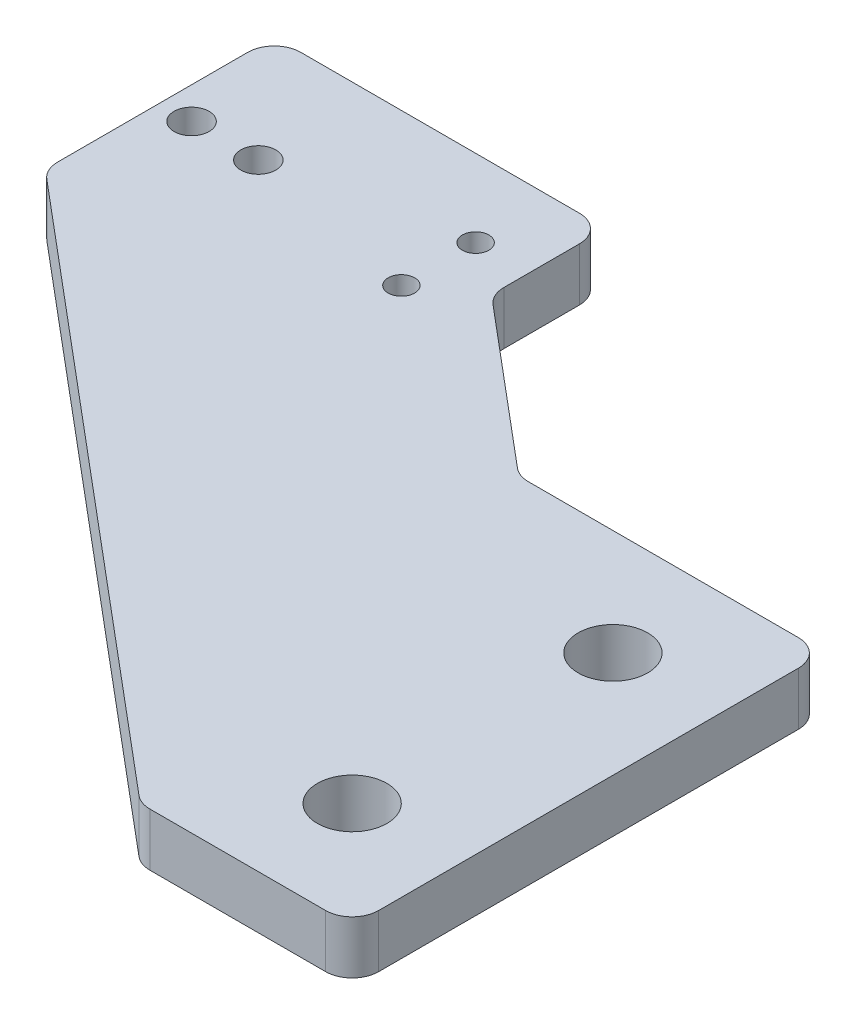
ISO-10303-21;
HEADER;
FILE_DESCRIPTION(('STEP AP214'),'2;1');
FILE_NAME('part.step','',(''),(''),'','','');
FILE_SCHEMA(('AUTOMOTIVE_DESIGN { 1 0 10303 214 1 1 1 1 }'));
ENDSEC;
DATA;
#1=APPLICATION_CONTEXT('core data for automotive mechanical design processes');
#2=APPLICATION_PROTOCOL_DEFINITION('international standard','automotive_design',2000,#1);
#3=PRODUCT_CONTEXT('',#1,'mechanical');
#4=PRODUCT('Part','Part','',(#3));
#5=PRODUCT_RELATED_PRODUCT_CATEGORY('part','',(#4));
#6=PRODUCT_DEFINITION_FORMATION('','',#4);
#7=PRODUCT_DEFINITION_CONTEXT('part definition',#1,'design');
#8=PRODUCT_DEFINITION('design','',#6,#7);
#9=PRODUCT_DEFINITION_SHAPE('','',#8);
#10=(LENGTH_UNIT() NAMED_UNIT(*) SI_UNIT(.MILLI.,.METRE.));
#11=(NAMED_UNIT(*) PLANE_ANGLE_UNIT() SI_UNIT($,.RADIAN.));
#12=(NAMED_UNIT(*) SI_UNIT($,.STERADIAN.) SOLID_ANGLE_UNIT());
#13=UNCERTAINTY_MEASURE_WITH_UNIT(LENGTH_MEASURE(1.E-05),#10,'distance_accuracy_value','');
#14=(GEOMETRIC_REPRESENTATION_CONTEXT(3) GLOBAL_UNCERTAINTY_ASSIGNED_CONTEXT((#13)) GLOBAL_UNIT_ASSIGNED_CONTEXT((#10,
#11,#12)) REPRESENTATION_CONTEXT('',''));
#15=CARTESIAN_POINT('',(0.,0.,0.));
#16=DIRECTION('',(0.,0.,1.));
#17=DIRECTION('',(1.,0.,0.));
#18=AXIS2_PLACEMENT_3D('',#15,#16,#17);
#19=CARTESIAN_POINT('',(927.099846982121,-19.0500000000002,839.21));
#20=DIRECTION('',(1.,0.,0.));
#21=DIRECTION('',(0.,0.,-1.));
#22=AXIS2_PLACEMENT_3D('',#19,#20,#21);
#23=PLANE('',#22);
#24=DIRECTION('',(0.,0.,-1.));
#25=VECTOR('',#24,1.);
#26=CARTESIAN_POINT('',(927.099846982121,-12.7000000000002,839.21));
#27=LINE('',#26,#25);
#28=CARTESIAN_POINT('',(927.099846982121,-12.7000000000002,892.68));
#29=VERTEX_POINT('',#28);
#30=CARTESIAN_POINT('',(927.099846982121,-12.7000000000002,842.385));
#31=VERTEX_POINT('',#30);
#32=EDGE_CURVE('E273',#29,#31,#27,.T.);
#33=ORIENTED_EDGE('',*,*,#32,.F.);
#34=DIRECTION('',(0.,1.,0.));
#35=VECTOR('',#34,1.);
#36=CARTESIAN_POINT('',(927.099846982121,-19.0500000000002,892.68));
#37=LINE('',#36,#35);
#38=CARTESIAN_POINT('',(927.099846982121,-19.0500000000002,892.68));
#39=VERTEX_POINT('',#38);
#40=EDGE_CURVE('E193',#29,#39,#37,.F.);
#41=ORIENTED_EDGE('',*,*,#40,.T.);
#42=DIRECTION('',(0.,0.,-1.));
#43=VECTOR('',#42,1.);
#44=CARTESIAN_POINT('',(927.099846982121,-19.0500000000002,839.21));
#45=LINE('',#44,#43);
#46=CARTESIAN_POINT('',(927.099846982121,-19.0500000000002,842.385));
#47=VERTEX_POINT('',#46);
#48=EDGE_CURVE('E170',#39,#47,#45,.T.);
#49=ORIENTED_EDGE('',*,*,#48,.T.);
#50=DIRECTION('',(0.,1.,0.));
#51=VECTOR('',#50,1.);
#52=CARTESIAN_POINT('',(927.099846982121,-19.0500000000002,842.385));
#53=LINE('',#52,#51);
#54=EDGE_CURVE('E190',#47,#31,#53,.T.);
#55=ORIENTED_EDGE('',*,*,#54,.T.);
#56=EDGE_LOOP('',(#33,#41,#49,#55));
#57=FACE_BOUND('',#56,.T.);
#58=ADVANCED_FACE('F34',(#57),#23,.T.);
#59=CARTESIAN_POINT('',(901.700153017879,-19.0500000000002,895.855));
#60=DIRECTION('',(0.,0.,1.));
#61=DIRECTION('',(1.,0.,0.));
#62=AXIS2_PLACEMENT_3D('',#59,#60,#61);
#63=PLANE('',#62);
#64=DIRECTION('',(1.,0.,0.));
#65=VECTOR('',#64,1.);
#66=CARTESIAN_POINT('',(901.700153017879,-19.0500000000002,895.855));
#67=LINE('',#66,#65);
#68=CARTESIAN_POINT('',(902.85776192086,-19.0500000000002,895.855));
#69=VERTEX_POINT('',#68);
#70=CARTESIAN_POINT('',(923.924846982121,-19.0500000000002,895.855));
#71=VERTEX_POINT('',#70);
#72=EDGE_CURVE('E175',#69,#71,#67,.T.);
#73=ORIENTED_EDGE('',*,*,#72,.T.);
#74=DIRECTION('',(0.,1.,0.));
#75=VECTOR('',#74,1.);
#76=CARTESIAN_POINT('',(923.924846982121,-19.0500000000002,895.855));
#77=LINE('',#76,#75);
#78=CARTESIAN_POINT('',(923.924846982121,-12.7000000000002,895.855));
#79=VERTEX_POINT('',#78);
#80=EDGE_CURVE('E169',#71,#79,#77,.T.);
#81=ORIENTED_EDGE('',*,*,#80,.T.);
#82=DIRECTION('',(1.,0.,0.));
#83=VECTOR('',#82,1.);
#84=CARTESIAN_POINT('',(901.700153017879,-12.7000000000002,895.855));
#85=LINE('',#84,#83);
#86=CARTESIAN_POINT('',(902.85776192086,-12.7000000000002,895.855));
#87=VERTEX_POINT('',#86);
#88=EDGE_CURVE('E152',#87,#79,#85,.T.);
#89=ORIENTED_EDGE('',*,*,#88,.F.);
#90=DIRECTION('',(0.,1.,0.));
#91=VECTOR('',#90,1.);
#92=CARTESIAN_POINT('',(902.85776192086,-19.0500000000002,895.855));
#93=LINE('',#92,#91);
#94=EDGE_CURVE('E166',#87,#69,#93,.F.);
#95=ORIENTED_EDGE('',*,*,#94,.T.);
#96=EDGE_LOOP('',(#73,#81,#89,#95));
#97=FACE_BOUND('',#96,.T.);
#98=ADVANCED_FACE('F165',(#97),#63,.T.);
#99=CARTESIAN_POINT('',(830.20015301788,-19.0500000000002,835.723499999999));
#100=DIRECTION('',(-0.643640690694834,0.,0.765327812954604));
#101=DIRECTION('',(0.765327812954604,0.,0.643640690694834));
#102=AXIS2_PLACEMENT_3D('',#99,#100,#101);
#103=PLANE('',#102);
#104=DIRECTION('',(0.765327812954604,0.,0.643640690694834));
#105=VECTOR('',#104,1.);
#106=CARTESIAN_POINT('',(830.20015301788,-19.0500000000002,835.723499999999));
#107=LINE('',#106,#105);
#108=CARTESIAN_POINT('',(831.331593824924,-19.0500000000002,836.675041718723));
#109=VERTEX_POINT('',#108);
#110=CARTESIAN_POINT('',(900.814202727904,-19.0500000000002,895.109915806131));
#111=VERTEX_POINT('',#110);
#112=EDGE_CURVE('E179',#109,#111,#107,.T.);
#113=ORIENTED_EDGE('',*,*,#112,.T.);
#114=DIRECTION('',(0.,1.,0.));
#115=VECTOR('',#114,1.);
#116=CARTESIAN_POINT('',(900.814202727904,-19.0500000000002,895.109915806131));
#117=LINE('',#116,#115);
#118=CARTESIAN_POINT('',(900.814202727904,-12.7000000000002,895.109915806131));
#119=VERTEX_POINT('',#118);
#120=EDGE_CURVE('E208',#111,#119,#117,.T.);
#121=ORIENTED_EDGE('',*,*,#120,.T.);
#122=DIRECTION('',(0.765327812954604,0.,0.643640690694834));
#123=VECTOR('',#122,1.);
#124=CARTESIAN_POINT('',(830.20015301788,-12.7000000000002,835.723499999999));
#125=LINE('',#124,#123);
#126=CARTESIAN_POINT('',(831.331593824924,-12.7000000000002,836.675041718723));
#127=VERTEX_POINT('',#126);
#128=EDGE_CURVE('E154',#127,#119,#125,.T.);
#129=ORIENTED_EDGE('',*,*,#128,.F.);
#130=DIRECTION('',(0.,1.,0.));
#131=VECTOR('',#130,1.);
#132=CARTESIAN_POINT('',(831.331593824924,-19.0500000000002,836.675041718723));
#133=LINE('',#132,#131);
#134=EDGE_CURVE('E206',#127,#109,#133,.F.);
#135=ORIENTED_EDGE('',*,*,#134,.T.);
#136=EDGE_LOOP('',(#113,#121,#129,#135));
#137=FACE_BOUND('',#136,.T.);
#138=ADVANCED_FACE('F373',(#137),#103,.T.);
#139=CARTESIAN_POINT('',(830.20015301788,-19.0500000000002,835.723499999999));
#140=DIRECTION('',(-1.,0.,0.));
#141=DIRECTION('',(0.,0.,1.));
#142=AXIS2_PLACEMENT_3D('',#139,#140,#141);
#143=PLANE('',#142);
#144=DIRECTION('',(0.,0.,1.));
#145=VECTOR('',#144,1.);
#146=CARTESIAN_POINT('',(830.20015301788,-19.0500000000002,835.723499999999));
#147=LINE('',#146,#145);
#148=CARTESIAN_POINT('',(830.20015301788,-19.0500000000002,811.466499999999));
#149=VERTEX_POINT('',#148);
#150=CARTESIAN_POINT('',(830.20015301788,-19.0500000000002,834.245125912593));
#151=VERTEX_POINT('',#150);
#152=EDGE_CURVE('E289',#149,#151,#147,.T.);
#153=ORIENTED_EDGE('',*,*,#152,.T.);
#154=DIRECTION('',(0.,1.,0.));
#155=VECTOR('',#154,1.);
#156=CARTESIAN_POINT('',(830.20015301788,-19.0500000000002,834.245125912593));
#157=LINE('',#156,#155);
#158=CARTESIAN_POINT('',(830.20015301788,-12.7000000000002,834.245125912593));
#159=VERTEX_POINT('',#158);
#160=EDGE_CURVE('E226',#151,#159,#157,.T.);
#161=ORIENTED_EDGE('',*,*,#160,.T.);
#162=DIRECTION('',(0.,0.,1.));
#163=VECTOR('',#162,1.);
#164=CARTESIAN_POINT('',(830.20015301788,-12.7000000000002,835.723499999999));
#165=LINE('',#164,#163);
#166=CARTESIAN_POINT('',(830.20015301788,-12.7000000000002,811.466499999999));
#167=VERTEX_POINT('',#166);
#168=EDGE_CURVE('E308',#167,#159,#165,.T.);
#169=ORIENTED_EDGE('',*,*,#168,.F.);
#170=DIRECTION('',(0.,1.,0.));
#171=VECTOR('',#170,1.);
#172=CARTESIAN_POINT('',(830.20015301788,-19.0500000000002,811.466499999999));
#173=LINE('',#172,#171);
#174=EDGE_CURVE('E224',#167,#149,#173,.F.);
#175=ORIENTED_EDGE('',*,*,#174,.T.);
#176=EDGE_LOOP('',(#153,#161,#169,#175));
#177=FACE_BOUND('',#176,.T.);
#178=ADVANCED_FACE('F313',(#177),#143,.T.);
#179=CARTESIAN_POINT('',(830.20015301788,-19.0500000000002,808.291499999999));
#180=DIRECTION('',(0.,0.,-1.));
#181=DIRECTION('',(-1.,0.,0.));
#182=AXIS2_PLACEMENT_3D('',#179,#180,#181);
#183=PLANE('',#182);
#184=DIRECTION('',(-1.,0.,0.));
#185=VECTOR('',#184,1.);
#186=CARTESIAN_POINT('',(853.82015301788,-19.0500000000002,808.291499999999));
#187=LINE('',#186,#185);
#188=CARTESIAN_POINT('',(866.775153017879,-19.0500000000002,808.291499999999));
#189=VERTEX_POINT('',#188);
#190=CARTESIAN_POINT('',(833.37515301788,-19.0500000000002,808.291499999999));
#191=VERTEX_POINT('',#190);
#192=EDGE_CURVE('E286',#189,#191,#187,.T.);
#193=ORIENTED_EDGE('',*,*,#192,.T.);
#194=DIRECTION('',(0.,1.,0.));
#195=VECTOR('',#194,1.);
#196=CARTESIAN_POINT('',(833.37515301788,-19.0500000000002,808.291499999999));
#197=LINE('',#196,#195);
#198=CARTESIAN_POINT('',(833.37515301788,-12.7000000000002,808.291499999999));
#199=VERTEX_POINT('',#198);
#200=EDGE_CURVE('E231',#191,#199,#197,.T.);
#201=ORIENTED_EDGE('',*,*,#200,.T.);
#202=DIRECTION('',(-1.,0.,0.));
#203=VECTOR('',#202,1.);
#204=CARTESIAN_POINT('',(830.20015301788,-12.7000000000002,808.291499999999));
#205=LINE('',#204,#203);
#206=CARTESIAN_POINT('',(866.775153017879,-12.7000000000002,808.291499999999));
#207=VERTEX_POINT('',#206);
#208=EDGE_CURVE('E305',#207,#199,#205,.T.);
#209=ORIENTED_EDGE('',*,*,#208,.F.);
#210=DIRECTION('',(0.,1.,0.));
#211=VECTOR('',#210,1.);
#212=CARTESIAN_POINT('',(866.775153017879,-19.0500000000002,808.291499999999));
#213=LINE('',#212,#211);
#214=EDGE_CURVE('E229',#207,#189,#213,.F.);
#215=ORIENTED_EDGE('',*,*,#214,.T.);
#216=EDGE_LOOP('',(#193,#201,#209,#215));
#217=FACE_BOUND('',#216,.T.);
#218=ADVANCED_FACE('F325',(#217),#183,.T.);
#219=CARTESIAN_POINT('',(869.950153017879,-19.0500000000002,808.291499999999));
#220=DIRECTION('',(1.,0.,0.));
#221=DIRECTION('',(0.,0.,-1.));
#222=AXIS2_PLACEMENT_3D('',#219,#220,#221);
#223=PLANE('',#222);
#224=DIRECTION('',(0.,0.,-1.));
#225=VECTOR('',#224,1.);
#226=CARTESIAN_POINT('',(869.950153017879,-12.7000000000002,808.291499999999));
#227=LINE('',#226,#225);
#228=CARTESIAN_POINT('',(869.950153017879,-12.7000000000002,820.529125912593));
#229=VERTEX_POINT('',#228);
#230=CARTESIAN_POINT('',(869.950153017879,-12.7000000000002,811.466499999999));
#231=VERTEX_POINT('',#230);
#232=EDGE_CURVE('E302',#229,#231,#227,.T.);
#233=ORIENTED_EDGE('',*,*,#232,.F.);
#234=DIRECTION('',(0.,1.,0.));
#235=VECTOR('',#234,1.);
#236=CARTESIAN_POINT('',(869.950153017879,-19.0500000000002,820.529125912593));
#237=LINE('',#236,#235);
#238=CARTESIAN_POINT('',(869.950153017879,-19.0500000000002,820.529125912593));
#239=VERTEX_POINT('',#238);
#240=EDGE_CURVE('E222',#229,#239,#237,.F.);
#241=ORIENTED_EDGE('',*,*,#240,.T.);
#242=DIRECTION('',(0.,0.,-1.));
#243=VECTOR('',#242,1.);
#244=CARTESIAN_POINT('',(869.950153017879,-19.0500000000002,808.291499999999));
#245=LINE('',#244,#243);
#246=CARTESIAN_POINT('',(869.950153017879,-19.0500000000002,811.466499999999));
#247=VERTEX_POINT('',#246);
#248=EDGE_CURVE('E283',#239,#247,#245,.T.);
#249=ORIENTED_EDGE('',*,*,#248,.T.);
#250=DIRECTION('',(0.,1.,0.));
#251=VECTOR('',#250,1.);
#252=CARTESIAN_POINT('',(869.950153017879,-19.0500000000002,811.466499999999));
#253=LINE('',#252,#251);
#254=EDGE_CURVE('E219',#247,#231,#253,.T.);
#255=ORIENTED_EDGE('',*,*,#254,.T.);
#256=EDGE_LOOP('',(#233,#241,#249,#255));
#257=FACE_BOUND('',#256,.T.);
#258=ADVANCED_FACE('F334',(#257),#223,.T.);
#259=CARTESIAN_POINT('',(869.950153017879,-19.0500000000002,822.007499999999));
#260=DIRECTION('',(0.643640690694834,0.,-0.765327812954604));
#261=DIRECTION('',(-0.765327812954604,0.,-0.643640690694834));
#262=AXIS2_PLACEMENT_3D('',#259,#260,#261);
#263=PLANE('',#262);
#264=DIRECTION('',(-0.765327812954604,0.,-0.643640690694834));
#265=VECTOR('',#264,1.);
#266=CARTESIAN_POINT('',(869.950153017879,-19.0500000000002,822.007499999999));
#267=LINE('',#266,#265);
#268=CARTESIAN_POINT('',(889.519018423505,-19.0500000000002,838.464915806131));
#269=VERTEX_POINT('',#268);
#270=CARTESIAN_POINT('',(871.081593824923,-19.0500000000002,822.959041718723));
#271=VERTEX_POINT('',#270);
#272=EDGE_CURVE('E280',#269,#271,#267,.T.);
#273=ORIENTED_EDGE('',*,*,#272,.T.);
#274=DIRECTION('',(0.,1.,0.));
#275=VECTOR('',#274,1.);
#276=CARTESIAN_POINT('',(871.081593824923,-12.7000000000002,822.959041718723));
#277=LINE('',#276,#275);
#278=CARTESIAN_POINT('',(871.081593824923,-12.7000000000002,822.959041718723));
#279=VERTEX_POINT('',#278);
#280=EDGE_CURVE('E216',#271,#279,#277,.T.);
#281=ORIENTED_EDGE('',*,*,#280,.T.);
#282=DIRECTION('',(-0.765327812954604,0.,-0.643640690694834));
#283=VECTOR('',#282,1.);
#284=CARTESIAN_POINT('',(869.950153017879,-12.7000000000002,822.007499999999));
#285=LINE('',#284,#283);
#286=CARTESIAN_POINT('',(889.519018423505,-12.7000000000002,838.464915806131));
#287=VERTEX_POINT('',#286);
#288=EDGE_CURVE('E299',#287,#279,#285,.T.);
#289=ORIENTED_EDGE('',*,*,#288,.F.);
#290=DIRECTION('',(0.,1.,0.));
#291=VECTOR('',#290,1.);
#292=CARTESIAN_POINT('',(889.519018423505,-19.0500000000002,838.464915806131));
#293=LINE('',#292,#291);
#294=EDGE_CURVE('E214',#287,#269,#293,.F.);
#295=ORIENTED_EDGE('',*,*,#294,.T.);
#296=EDGE_LOOP('',(#273,#281,#289,#295));
#297=FACE_BOUND('',#296,.T.);
#298=ADVANCED_FACE('F340',(#297),#263,.T.);
#299=CARTESIAN_POINT('',(890.40496871348,-19.0500000000002,839.21));
#300=DIRECTION('',(0.,0.,-1.));
#301=DIRECTION('',(-1.,0.,0.));
#302=AXIS2_PLACEMENT_3D('',#299,#300,#301);
#303=PLANE('',#302);
#304=DIRECTION('',(-1.,0.,0.));
#305=VECTOR('',#304,1.);
#306=CARTESIAN_POINT('',(890.40496871348,-12.7000000000002,839.21));
#307=LINE('',#306,#305);
#308=CARTESIAN_POINT('',(923.92484698212,-12.7000000000002,839.21));
#309=VERTEX_POINT('',#308);
#310=CARTESIAN_POINT('',(891.562577616461,-12.7000000000002,839.21));
#311=VERTEX_POINT('',#310);
#312=EDGE_CURVE('E296',#309,#311,#307,.T.);
#313=ORIENTED_EDGE('',*,*,#312,.F.);
#314=DIRECTION('',(0.,1.,0.));
#315=VECTOR('',#314,1.);
#316=CARTESIAN_POINT('',(923.92484698212,-19.0500000000002,839.21));
#317=LINE('',#316,#315);
#318=CARTESIAN_POINT('',(923.92484698212,-19.0500000000002,839.21));
#319=VERTEX_POINT('',#318);
#320=EDGE_CURVE('E56',#309,#319,#317,.F.);
#321=ORIENTED_EDGE('',*,*,#320,.T.);
#322=DIRECTION('',(-1.,0.,0.));
#323=VECTOR('',#322,1.);
#324=CARTESIAN_POINT('',(890.40496871348,-19.0500000000002,839.21));
#325=LINE('',#324,#323);
#326=CARTESIAN_POINT('',(891.562577616461,-19.0500000000002,839.21));
#327=VERTEX_POINT('',#326);
#328=EDGE_CURVE('E278',#319,#327,#325,.T.);
#329=ORIENTED_EDGE('',*,*,#328,.T.);
#330=DIRECTION('',(0.,1.,0.));
#331=VECTOR('',#330,1.);
#332=CARTESIAN_POINT('',(891.562577616461,-12.7000000000002,839.21));
#333=LINE('',#332,#331);
#334=EDGE_CURVE('E210',#327,#311,#333,.T.);
#335=ORIENTED_EDGE('',*,*,#334,.T.);
#336=EDGE_LOOP('',(#313,#321,#329,#335));
#337=FACE_BOUND('',#336,.T.);
#338=ADVANCED_FACE('F346',(#337),#303,.T.);
#339=CARTESIAN_POINT('',(0.,-19.0500000000002,0.));
#340=DIRECTION('',(0.,1.,0.));
#341=DIRECTION('',(0.,0.,1.));
#342=AXIS2_PLACEMENT_3D('',#339,#340,#341);
#343=PLANE('',#342);
#344=CARTESIAN_POINT('',(914.4,-19.0500000000002,883.155));
#345=DIRECTION('',(0.,1.,0.));
#346=DIRECTION('',(0.,0.,1.));
#347=AXIS2_PLACEMENT_3D('',#344,#345,#346);
#348=CIRCLE('',#347,4.16560000000004);
#349=CARTESIAN_POINT('',(914.4,-19.0500000000002,887.3206));
#350=VERTEX_POINT('',#349);
#351=EDGE_CURVE('E252',#350,#350,#348,.T.);
#352=ORIENTED_EDGE('',*,*,#351,.T.);
#353=EDGE_LOOP('',(#352));
#354=FACE_BOUND('',#353,.T.);
#355=CARTESIAN_POINT('',(914.4,-19.0500000000002,851.91));
#356=DIRECTION('',(0.,1.,0.));
#357=DIRECTION('',(0.,0.,1.));
#358=AXIS2_PLACEMENT_3D('',#355,#356,#357);
#359=CIRCLE('',#358,4.16560000000004);
#360=CARTESIAN_POINT('',(914.4,-19.0500000000002,856.0756));
#361=VERTEX_POINT('',#360);
#362=EDGE_CURVE('E241',#361,#361,#359,.T.);
#363=ORIENTED_EDGE('',*,*,#362,.T.);
#364=EDGE_LOOP('',(#363));
#365=FACE_BOUND('',#364,.T.);
#366=CARTESIAN_POINT('',(842.010153017879,-19.0500000000002,822.007499999999));
#367=DIRECTION('',(0.,1.,0.));
#368=DIRECTION('',(0.,0.,1.));
#369=AXIS2_PLACEMENT_3D('',#366,#367,#368);
#370=CIRCLE('',#369,2.09999999099999);
#371=CARTESIAN_POINT('',(842.010153017879,-19.0500000000002,824.107499990999));
#372=VERTEX_POINT('',#371);
#373=EDGE_CURVE('E245',#372,#372,#370,.T.);
#374=ORIENTED_EDGE('',*,*,#373,.T.);
#375=EDGE_LOOP('',(#374));
#376=FACE_BOUND('',#375,.T.);
#377=CARTESIAN_POINT('',(863.600153017879,-19.0500000000002,826.4525));
#378=DIRECTION('',(0.,1.,0.));
#379=DIRECTION('',(0.,0.,1.));
#380=AXIS2_PLACEMENT_3D('',#377,#378,#379);
#381=CIRCLE('',#380,1.58749999999992);
#382=CARTESIAN_POINT('',(863.600153017879,-19.0500000000002,828.039999999999));
#383=VERTEX_POINT('',#382);
#384=EDGE_CURVE('E258',#383,#383,#381,.T.);
#385=ORIENTED_EDGE('',*,*,#384,.T.);
#386=EDGE_LOOP('',(#385));
#387=FACE_BOUND('',#386,.T.);
#388=CARTESIAN_POINT('',(863.600153017879,-19.0500000000002,817.5625));
#389=DIRECTION('',(0.,1.,0.));
#390=DIRECTION('',(0.,0.,1.));
#391=AXIS2_PLACEMENT_3D('',#388,#389,#390);
#392=CIRCLE('',#391,1.58749999999992);
#393=CARTESIAN_POINT('',(863.600153017879,-19.0500000000002,819.15));
#394=VERTEX_POINT('',#393);
#395=EDGE_CURVE('E264',#394,#394,#392,.T.);
#396=ORIENTED_EDGE('',*,*,#395,.T.);
#397=EDGE_LOOP('',(#396));
#398=FACE_BOUND('',#397,.T.);
#399=CARTESIAN_POINT('',(834.010153017879,-19.0500000000002,822.007499999999));
#400=DIRECTION('',(0.,1.,0.));
#401=DIRECTION('',(0.,0.,1.));
#402=AXIS2_PLACEMENT_3D('',#399,#400,#401);
#403=CIRCLE('',#402,2.09999999099999);
#404=CARTESIAN_POINT('',(834.010153017879,-19.0500000000002,824.107499990999));
#405=VERTEX_POINT('',#404);
#406=EDGE_CURVE('E270',#405,#405,#403,.T.);
#407=ORIENTED_EDGE('',*,*,#406,.T.);
#408=EDGE_LOOP('',(#407));
#409=FACE_BOUND('',#408,.T.);
#410=ORIENTED_EDGE('',*,*,#48,.F.);
#411=CARTESIAN_POINT('',(923.924846982121,-19.0500000000002,892.68));
#412=DIRECTION('',(0.,1.,0.));
#413=DIRECTION('',(0.,0.,1.));
#414=AXIS2_PLACEMENT_3D('',#411,#412,#413);
#415=CIRCLE('',#414,3.175);
#416=EDGE_CURVE('E204',#39,#71,#415,.F.);
#417=ORIENTED_EDGE('',*,*,#416,.T.);
#418=ORIENTED_EDGE('',*,*,#72,.F.);
#419=CARTESIAN_POINT('',(902.85776192086,-19.0500000000002,892.68));
#420=DIRECTION('',(0.,1.,0.));
#421=DIRECTION('',(0.,0.,1.));
#422=AXIS2_PLACEMENT_3D('',#419,#420,#421);
#423=CIRCLE('',#422,3.175);
#424=EDGE_CURVE('E174',#69,#111,#423,.F.);
#425=ORIENTED_EDGE('',*,*,#424,.T.);
#426=ORIENTED_EDGE('',*,*,#112,.F.);
#427=CARTESIAN_POINT('',(833.37515301788,-19.0500000000002,834.245125912593));
#428=DIRECTION('',(0.,1.,0.));
#429=DIRECTION('',(0.,0.,1.));
#430=AXIS2_PLACEMENT_3D('',#427,#428,#429);
#431=CIRCLE('',#430,3.175);
#432=EDGE_CURVE('E199',#109,#151,#431,.F.);
#433=ORIENTED_EDGE('',*,*,#432,.T.);
#434=ORIENTED_EDGE('',*,*,#152,.F.);
#435=CARTESIAN_POINT('',(833.37515301788,-19.0500000000002,811.466499999999));
#436=DIRECTION('',(0.,1.,0.));
#437=DIRECTION('',(0.,0.,1.));
#438=AXIS2_PLACEMENT_3D('',#435,#436,#437);
#439=CIRCLE('',#438,3.175);
#440=EDGE_CURVE('E197',#149,#191,#439,.F.);
#441=ORIENTED_EDGE('',*,*,#440,.T.);
#442=ORIENTED_EDGE('',*,*,#192,.F.);
#443=CARTESIAN_POINT('',(866.775153017879,-19.0500000000002,811.466499999999));
#444=DIRECTION('',(0.,1.,0.));
#445=DIRECTION('',(0.,0.,1.));
#446=AXIS2_PLACEMENT_3D('',#443,#444,#445);
#447=CIRCLE('',#446,3.175);
#448=EDGE_CURVE('E195',#189,#247,#447,.F.);
#449=ORIENTED_EDGE('',*,*,#448,.T.);
#450=ORIENTED_EDGE('',*,*,#248,.F.);
#451=CARTESIAN_POINT('',(873.125153017879,-19.0500000000002,820.529125912593));
#452=DIRECTION('',(0.,1.,0.));
#453=DIRECTION('',(0.,0.,1.));
#454=AXIS2_PLACEMENT_3D('',#451,#452,#453);
#455=CIRCLE('',#454,3.175);
#456=EDGE_CURVE('E236',#239,#271,#455,.T.);
#457=ORIENTED_EDGE('',*,*,#456,.T.);
#458=ORIENTED_EDGE('',*,*,#272,.F.);
#459=CARTESIAN_POINT('',(891.562577616461,-19.0500000000002,836.035));
#460=DIRECTION('',(0.,1.,0.));
#461=DIRECTION('',(0.,0.,1.));
#462=AXIS2_PLACEMENT_3D('',#459,#460,#461);
#463=CIRCLE('',#462,3.175);
#464=EDGE_CURVE('E11',#269,#327,#463,.T.);
#465=ORIENTED_EDGE('',*,*,#464,.T.);
#466=ORIENTED_EDGE('',*,*,#328,.F.);
#467=CARTESIAN_POINT('',(923.92484698212,-19.0500000000002,842.385));
#468=DIRECTION('',(0.,1.,0.));
#469=DIRECTION('',(0.,0.,1.));
#470=AXIS2_PLACEMENT_3D('',#467,#468,#469);
#471=CIRCLE('',#470,3.175);
#472=EDGE_CURVE('E201',#319,#47,#471,.F.);
#473=ORIENTED_EDGE('',*,*,#472,.T.);
#474=EDGE_LOOP('',(#410,#417,#418,#425,#426,#433,#434,#441,#442,#449,#450,#457,#458,#465,#466,#473));
#475=FACE_BOUND('',#474,.T.);
#476=ADVANCED_FACE('F322',(#354,#365,#376,#387,#398,#409,#475),#343,.F.);
#477=CARTESIAN_POINT('',(0.,-12.7000000000002,0.));
#478=DIRECTION('',(0.,1.,0.));
#479=DIRECTION('',(0.,0.,1.));
#480=AXIS2_PLACEMENT_3D('',#477,#478,#479);
#481=PLANE('',#480);
#482=CARTESIAN_POINT('',(914.4,-12.7000000000002,883.155));
#483=DIRECTION('',(0.,1.,0.));
#484=DIRECTION('',(0.,0.,1.));
#485=AXIS2_PLACEMENT_3D('',#482,#483,#484);
#486=CIRCLE('',#485,4.16560000000004);
#487=CARTESIAN_POINT('',(914.4,-12.7000000000002,887.3206));
#488=VERTEX_POINT('',#487);
#489=EDGE_CURVE('E38',#488,#488,#486,.T.);
#490=ORIENTED_EDGE('',*,*,#489,.F.);
#491=EDGE_LOOP('',(#490));
#492=FACE_BOUND('',#491,.T.);
#493=CARTESIAN_POINT('',(914.4,-12.7000000000002,851.91));
#494=DIRECTION('',(0.,1.,0.));
#495=DIRECTION('',(0.,0.,1.));
#496=AXIS2_PLACEMENT_3D('',#493,#494,#495);
#497=CIRCLE('',#496,4.16560000000004);
#498=CARTESIAN_POINT('',(914.4,-12.7000000000002,856.0756));
#499=VERTEX_POINT('',#498);
#500=EDGE_CURVE('E238',#499,#499,#497,.T.);
#501=ORIENTED_EDGE('',*,*,#500,.F.);
#502=EDGE_LOOP('',(#501));
#503=FACE_BOUND('',#502,.T.);
#504=CARTESIAN_POINT('',(842.010153017879,-12.7000000000002,822.007499999999));
#505=DIRECTION('',(0.,1.,0.));
#506=DIRECTION('',(0.,0.,1.));
#507=AXIS2_PLACEMENT_3D('',#504,#505,#506);
#508=CIRCLE('',#507,2.09999999099999);
#509=CARTESIAN_POINT('',(842.010153017879,-12.7000000000002,824.107499990999));
#510=VERTEX_POINT('',#509);
#511=EDGE_CURVE('E240',#510,#510,#508,.T.);
#512=ORIENTED_EDGE('',*,*,#511,.F.);
#513=EDGE_LOOP('',(#512));
#514=FACE_BOUND('',#513,.T.);
#515=CARTESIAN_POINT('',(863.600153017879,-12.7000000000002,826.4525));
#516=DIRECTION('',(0.,1.,0.));
#517=DIRECTION('',(0.,0.,1.));
#518=AXIS2_PLACEMENT_3D('',#515,#516,#517);
#519=CIRCLE('',#518,1.58749999999992);
#520=CARTESIAN_POINT('',(863.600153017879,-12.7000000000002,828.039999999999));
#521=VERTEX_POINT('',#520);
#522=EDGE_CURVE('E256',#521,#521,#519,.T.);
#523=ORIENTED_EDGE('',*,*,#522,.F.);
#524=EDGE_LOOP('',(#523));
#525=FACE_BOUND('',#524,.T.);
#526=CARTESIAN_POINT('',(863.600153017879,-12.7000000000002,817.5625));
#527=DIRECTION('',(0.,1.,0.));
#528=DIRECTION('',(0.,0.,1.));
#529=AXIS2_PLACEMENT_3D('',#526,#527,#528);
#530=CIRCLE('',#529,1.58749999999992);
#531=CARTESIAN_POINT('',(863.600153017879,-12.7000000000002,819.15));
#532=VERTEX_POINT('',#531);
#533=EDGE_CURVE('E261',#532,#532,#530,.T.);
#534=ORIENTED_EDGE('',*,*,#533,.F.);
#535=EDGE_LOOP('',(#534));
#536=FACE_BOUND('',#535,.T.);
#537=CARTESIAN_POINT('',(834.010153017879,-12.7000000000002,822.007499999999));
#538=DIRECTION('',(0.,1.,0.));
#539=DIRECTION('',(0.,0.,1.));
#540=AXIS2_PLACEMENT_3D('',#537,#538,#539);
#541=CIRCLE('',#540,2.09999999099999);
#542=CARTESIAN_POINT('',(834.010153017879,-12.7000000000002,824.107499990999));
#543=VERTEX_POINT('',#542);
#544=EDGE_CURVE('E267',#543,#543,#541,.T.);
#545=ORIENTED_EDGE('',*,*,#544,.F.);
#546=EDGE_LOOP('',(#545));
#547=FACE_BOUND('',#546,.T.);
#548=ORIENTED_EDGE('',*,*,#88,.T.);
#549=CARTESIAN_POINT('',(923.924846982121,-12.7000000000002,892.68));
#550=DIRECTION('',(0.,1.,0.));
#551=DIRECTION('',(0.,0.,1.));
#552=AXIS2_PLACEMENT_3D('',#549,#550,#551);
#553=CIRCLE('',#552,3.175);
#554=EDGE_CURVE('E159',#79,#29,#553,.T.);
#555=ORIENTED_EDGE('',*,*,#554,.T.);
#556=ORIENTED_EDGE('',*,*,#32,.T.);
#557=CARTESIAN_POINT('',(923.92484698212,-12.7000000000002,842.385));
#558=DIRECTION('',(0.,1.,0.));
#559=DIRECTION('',(0.,0.,1.));
#560=AXIS2_PLACEMENT_3D('',#557,#558,#559);
#561=CIRCLE('',#560,3.175);
#562=EDGE_CURVE('E160',#31,#309,#561,.T.);
#563=ORIENTED_EDGE('',*,*,#562,.T.);
#564=ORIENTED_EDGE('',*,*,#312,.T.);
#565=CARTESIAN_POINT('',(891.562577616461,-12.7000000000002,836.035));
#566=DIRECTION('',(0.,1.,0.));
#567=DIRECTION('',(0.,0.,1.));
#568=AXIS2_PLACEMENT_3D('',#565,#566,#567);
#569=CIRCLE('',#568,3.175);
#570=EDGE_CURVE('E43',#311,#287,#569,.F.);
#571=ORIENTED_EDGE('',*,*,#570,.T.);
#572=ORIENTED_EDGE('',*,*,#288,.T.);
#573=CARTESIAN_POINT('',(873.125153017879,-12.7000000000002,820.529125912593));
#574=DIRECTION('',(0.,1.,0.));
#575=DIRECTION('',(0.,0.,1.));
#576=AXIS2_PLACEMENT_3D('',#573,#574,#575);
#577=CIRCLE('',#576,3.175);
#578=EDGE_CURVE('E234',#279,#229,#577,.F.);
#579=ORIENTED_EDGE('',*,*,#578,.T.);
#580=ORIENTED_EDGE('',*,*,#232,.T.);
#581=CARTESIAN_POINT('',(866.775153017879,-12.7000000000002,811.466499999999));
#582=DIRECTION('',(0.,1.,0.));
#583=DIRECTION('',(0.,0.,1.));
#584=AXIS2_PLACEMENT_3D('',#581,#582,#583);
#585=CIRCLE('',#584,3.175);
#586=EDGE_CURVE('E177',#231,#207,#585,.T.);
#587=ORIENTED_EDGE('',*,*,#586,.T.);
#588=ORIENTED_EDGE('',*,*,#208,.T.);
#589=CARTESIAN_POINT('',(833.37515301788,-12.7000000000002,811.466499999999));
#590=DIRECTION('',(0.,1.,0.));
#591=DIRECTION('',(0.,0.,1.));
#592=AXIS2_PLACEMENT_3D('',#589,#590,#591);
#593=CIRCLE('',#592,3.175);
#594=EDGE_CURVE('E184',#199,#167,#593,.T.);
#595=ORIENTED_EDGE('',*,*,#594,.T.);
#596=ORIENTED_EDGE('',*,*,#168,.T.);
#597=CARTESIAN_POINT('',(833.37515301788,-12.7000000000002,834.245125912593));
#598=DIRECTION('',(0.,1.,0.));
#599=DIRECTION('',(0.,0.,1.));
#600=AXIS2_PLACEMENT_3D('',#597,#598,#599);
#601=CIRCLE('',#600,3.175);
#602=EDGE_CURVE('E186',#159,#127,#601,.T.);
#603=ORIENTED_EDGE('',*,*,#602,.T.);
#604=ORIENTED_EDGE('',*,*,#128,.T.);
#605=CARTESIAN_POINT('',(902.85776192086,-12.7000000000002,892.68));
#606=DIRECTION('',(0.,1.,0.));
#607=DIRECTION('',(0.,0.,1.));
#608=AXIS2_PLACEMENT_3D('',#605,#606,#607);
#609=CIRCLE('',#608,3.175);
#610=EDGE_CURVE('E149',#119,#87,#609,.T.);
#611=ORIENTED_EDGE('',*,*,#610,.T.);
#612=EDGE_LOOP('',(#548,#555,#556,#563,#564,#571,#572,#579,#580,#587,#588,#595,#596,#603,#604,#611));
#613=FACE_BOUND('',#612,.T.);
#614=ADVANCED_FACE('F151',(#492,#503,#514,#525,#536,#547,#613),#481,.T.);
#615=CARTESIAN_POINT('',(834.010153017879,-19.0500000000002,822.007499999999));
#616=DIRECTION('',(0.,1.,0.));
#617=DIRECTION('',(0.,0.,1.));
#618=AXIS2_PLACEMENT_3D('',#615,#616,#617);
#619=CYLINDRICAL_SURFACE('',#618,2.09999999099999);
#620=ORIENTED_EDGE('',*,*,#406,.F.);
#621=EDGE_LOOP('',(#620));
#622=FACE_BOUND('',#621,.T.);
#623=ORIENTED_EDGE('',*,*,#544,.T.);
#624=EDGE_LOOP('',(#623));
#625=FACE_BOUND('',#624,.T.);
#626=ADVANCED_FACE('F391',(#622,#625),#619,.F.);
#627=CARTESIAN_POINT('',(863.600153017879,-19.0500000000002,817.5625));
#628=DIRECTION('',(0.,1.,0.));
#629=DIRECTION('',(0.,0.,1.));
#630=AXIS2_PLACEMENT_3D('',#627,#628,#629);
#631=CYLINDRICAL_SURFACE('',#630,1.58749999999992);
#632=ORIENTED_EDGE('',*,*,#395,.F.);
#633=EDGE_LOOP('',(#632));
#634=FACE_BOUND('',#633,.T.);
#635=ORIENTED_EDGE('',*,*,#533,.T.);
#636=EDGE_LOOP('',(#635));
#637=FACE_BOUND('',#636,.T.);
#638=ADVANCED_FACE('F398',(#634,#637),#631,.F.);
#639=CARTESIAN_POINT('',(863.600153017879,-19.0500000000002,826.4525));
#640=DIRECTION('',(0.,1.,0.));
#641=DIRECTION('',(0.,0.,1.));
#642=AXIS2_PLACEMENT_3D('',#639,#640,#641);
#643=CYLINDRICAL_SURFACE('',#642,1.58749999999992);
#644=ORIENTED_EDGE('',*,*,#384,.F.);
#645=EDGE_LOOP('',(#644));
#646=FACE_BOUND('',#645,.T.);
#647=ORIENTED_EDGE('',*,*,#522,.T.);
#648=EDGE_LOOP('',(#647));
#649=FACE_BOUND('',#648,.T.);
#650=ADVANCED_FACE('F365',(#646,#649),#643,.F.);
#651=CARTESIAN_POINT('',(842.010153017879,-19.0500000000002,822.007499999999));
#652=DIRECTION('',(0.,1.,0.));
#653=DIRECTION('',(0.,0.,1.));
#654=AXIS2_PLACEMENT_3D('',#651,#652,#653);
#655=CYLINDRICAL_SURFACE('',#654,2.09999999099999);
#656=ORIENTED_EDGE('',*,*,#373,.F.);
#657=EDGE_LOOP('',(#656));
#658=FACE_BOUND('',#657,.T.);
#659=ORIENTED_EDGE('',*,*,#511,.T.);
#660=EDGE_LOOP('',(#659));
#661=FACE_BOUND('',#660,.T.);
#662=ADVANCED_FACE('F358',(#658,#661),#655,.F.);
#663=CARTESIAN_POINT('',(923.924846982121,-19.0500000000002,892.68));
#664=DIRECTION('',(0.,1.,0.));
#665=DIRECTION('',(0.,0.,1.));
#666=AXIS2_PLACEMENT_3D('',#663,#664,#665);
#667=CYLINDRICAL_SURFACE('',#666,3.175);
#668=ORIENTED_EDGE('',*,*,#416,.F.);
#669=ORIENTED_EDGE('',*,*,#40,.F.);
#670=ORIENTED_EDGE('',*,*,#554,.F.);
#671=ORIENTED_EDGE('',*,*,#80,.F.);
#672=EDGE_LOOP('',(#668,#669,#670,#671));
#673=FACE_BOUND('',#672,.T.);
#674=ADVANCED_FACE('F356',(#673),#667,.T.);
#675=CARTESIAN_POINT('',(902.85776192086,-19.0500000000002,892.68));
#676=DIRECTION('',(0.,1.,0.));
#677=DIRECTION('',(0.,0.,1.));
#678=AXIS2_PLACEMENT_3D('',#675,#676,#677);
#679=CYLINDRICAL_SURFACE('',#678,3.175);
#680=ORIENTED_EDGE('',*,*,#424,.F.);
#681=ORIENTED_EDGE('',*,*,#94,.F.);
#682=ORIENTED_EDGE('',*,*,#610,.F.);
#683=ORIENTED_EDGE('',*,*,#120,.F.);
#684=EDGE_LOOP('',(#680,#681,#682,#683));
#685=FACE_BOUND('',#684,.T.);
#686=ADVANCED_FACE('F173',(#685),#679,.T.);
#687=CARTESIAN_POINT('',(923.92484698212,-19.0500000000002,842.385));
#688=DIRECTION('',(0.,1.,0.));
#689=DIRECTION('',(0.,0.,1.));
#690=AXIS2_PLACEMENT_3D('',#687,#688,#689);
#691=CYLINDRICAL_SURFACE('',#690,3.175);
#692=ORIENTED_EDGE('',*,*,#472,.F.);
#693=ORIENTED_EDGE('',*,*,#320,.F.);
#694=ORIENTED_EDGE('',*,*,#562,.F.);
#695=ORIENTED_EDGE('',*,*,#54,.F.);
#696=EDGE_LOOP('',(#692,#693,#694,#695));
#697=FACE_BOUND('',#696,.T.);
#698=ADVANCED_FACE('F351',(#697),#691,.T.);
#699=CARTESIAN_POINT('',(873.125153017879,-19.0500000000002,820.529125912593));
#700=DIRECTION('',(0.,-1.,0.));
#701=DIRECTION('',(0.,0.,-1.));
#702=AXIS2_PLACEMENT_3D('',#699,#700,#701);
#703=CYLINDRICAL_SURFACE('',#702,3.175);
#704=ORIENTED_EDGE('',*,*,#456,.F.);
#705=ORIENTED_EDGE('',*,*,#240,.F.);
#706=ORIENTED_EDGE('',*,*,#578,.F.);
#707=ORIENTED_EDGE('',*,*,#280,.F.);
#708=EDGE_LOOP('',(#704,#705,#706,#707));
#709=FACE_BOUND('',#708,.T.);
#710=ADVANCED_FACE('F337',(#709),#703,.F.);
#711=CARTESIAN_POINT('',(891.562577616461,-19.0500000000002,836.035));
#712=DIRECTION('',(0.,-1.,0.));
#713=DIRECTION('',(0.,0.,-1.));
#714=AXIS2_PLACEMENT_3D('',#711,#712,#713);
#715=CYLINDRICAL_SURFACE('',#714,3.175);
#716=ORIENTED_EDGE('',*,*,#464,.F.);
#717=ORIENTED_EDGE('',*,*,#294,.F.);
#718=ORIENTED_EDGE('',*,*,#570,.F.);
#719=ORIENTED_EDGE('',*,*,#334,.F.);
#720=EDGE_LOOP('',(#716,#717,#718,#719));
#721=FACE_BOUND('',#720,.T.);
#722=ADVANCED_FACE('F344',(#721),#715,.F.);
#723=CARTESIAN_POINT('',(833.37515301788,-19.0500000000002,834.245125912593));
#724=DIRECTION('',(0.,1.,0.));
#725=DIRECTION('',(0.,0.,1.));
#726=AXIS2_PLACEMENT_3D('',#723,#724,#725);
#727=CYLINDRICAL_SURFACE('',#726,3.175);
#728=ORIENTED_EDGE('',*,*,#432,.F.);
#729=ORIENTED_EDGE('',*,*,#134,.F.);
#730=ORIENTED_EDGE('',*,*,#602,.F.);
#731=ORIENTED_EDGE('',*,*,#160,.F.);
#732=EDGE_LOOP('',(#728,#729,#730,#731));
#733=FACE_BOUND('',#732,.T.);
#734=ADVANCED_FACE('F456',(#733),#727,.T.);
#735=CARTESIAN_POINT('',(833.37515301788,-19.0500000000002,811.466499999999));
#736=DIRECTION('',(0.,1.,0.));
#737=DIRECTION('',(0.,0.,1.));
#738=AXIS2_PLACEMENT_3D('',#735,#736,#737);
#739=CYLINDRICAL_SURFACE('',#738,3.175);
#740=ORIENTED_EDGE('',*,*,#440,.F.);
#741=ORIENTED_EDGE('',*,*,#174,.F.);
#742=ORIENTED_EDGE('',*,*,#594,.F.);
#743=ORIENTED_EDGE('',*,*,#200,.F.);
#744=EDGE_LOOP('',(#740,#741,#742,#743));
#745=FACE_BOUND('',#744,.T.);
#746=ADVANCED_FACE('F318',(#745),#739,.T.);
#747=CARTESIAN_POINT('',(866.775153017879,-19.0500000000002,811.466499999999));
#748=DIRECTION('',(0.,1.,0.));
#749=DIRECTION('',(0.,0.,1.));
#750=AXIS2_PLACEMENT_3D('',#747,#748,#749);
#751=CYLINDRICAL_SURFACE('',#750,3.175);
#752=ORIENTED_EDGE('',*,*,#448,.F.);
#753=ORIENTED_EDGE('',*,*,#214,.F.);
#754=ORIENTED_EDGE('',*,*,#586,.F.);
#755=ORIENTED_EDGE('',*,*,#254,.F.);
#756=EDGE_LOOP('',(#752,#753,#754,#755));
#757=FACE_BOUND('',#756,.T.);
#758=ADVANCED_FACE('F36',(#757),#751,.T.);
#759=CARTESIAN_POINT('',(914.4,-19.0500000000002,851.91));
#760=DIRECTION('',(0.,1.,0.));
#761=DIRECTION('',(0.,0.,1.));
#762=AXIS2_PLACEMENT_3D('',#759,#760,#761);
#763=CYLINDRICAL_SURFACE('',#762,4.16560000000004);
#764=ORIENTED_EDGE('',*,*,#500,.T.);
#765=EDGE_LOOP('',(#764));
#766=FACE_BOUND('',#765,.T.);
#767=ORIENTED_EDGE('',*,*,#362,.F.);
#768=EDGE_LOOP('',(#767));
#769=FACE_BOUND('',#768,.T.);
#770=ADVANCED_FACE('F406',(#766,#769),#763,.F.);
#771=CARTESIAN_POINT('',(914.4,-19.0500000000002,883.155));
#772=DIRECTION('',(0.,1.,0.));
#773=DIRECTION('',(0.,0.,1.));
#774=AXIS2_PLACEMENT_3D('',#771,#772,#773);
#775=CYLINDRICAL_SURFACE('',#774,4.16560000000004);
#776=ORIENTED_EDGE('',*,*,#489,.T.);
#777=EDGE_LOOP('',(#776));
#778=FACE_BOUND('',#777,.T.);
#779=ORIENTED_EDGE('',*,*,#351,.F.);
#780=EDGE_LOOP('',(#779));
#781=FACE_BOUND('',#780,.T.);
#782=ADVANCED_FACE('F409',(#778,#781),#775,.F.);
#783=CLOSED_SHELL('',(#58,#98,#138,#178,#218,#258,#298,#338,#476,#614,#626,#638,#650,#662,#674,
#686,#698,#710,#722,#734,#746,#758,#770,#782));
#784=MANIFOLD_SOLID_BREP('B2',#783);
#785=ADVANCED_BREP_SHAPE_REPRESENTATION('',(#18,#784),#14);
#786=SHAPE_DEFINITION_REPRESENTATION(#9,#785);
ENDSEC;
END-ISO-10303-21;
